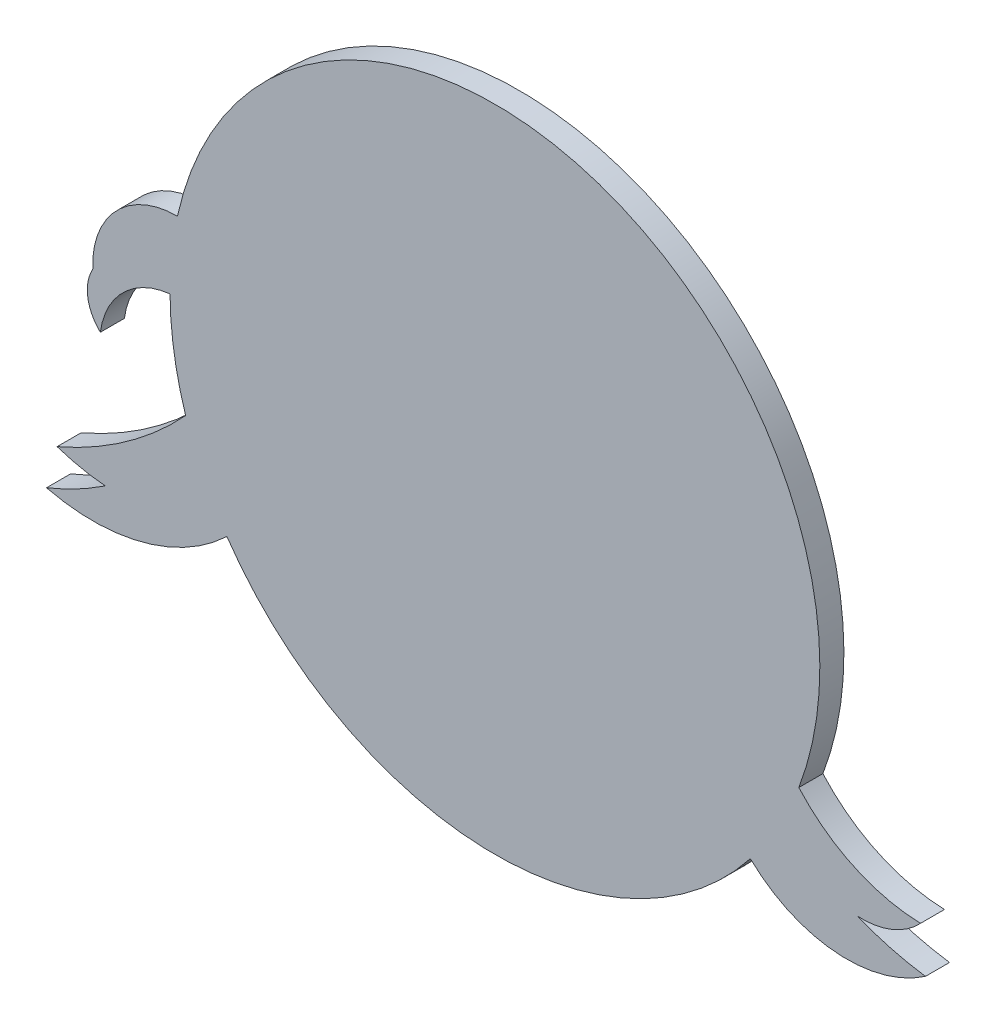
ISO-10303-21;
HEADER;
FILE_DESCRIPTION(('STEP AP214'),'2;1');
FILE_NAME('part.step','',(''),(''),'','','');
FILE_SCHEMA(('AUTOMOTIVE_DESIGN { 1 0 10303 214 1 1 1 1 }'));
ENDSEC;
DATA;
#1=APPLICATION_CONTEXT('core data for automotive mechanical design processes');
#2=APPLICATION_PROTOCOL_DEFINITION('international standard','automotive_design',2000,#1);
#3=PRODUCT_CONTEXT('',#1,'mechanical');
#4=PRODUCT('Part','Part','',(#3));
#5=PRODUCT_RELATED_PRODUCT_CATEGORY('part','',(#4));
#6=PRODUCT_DEFINITION_FORMATION('','',#4);
#7=PRODUCT_DEFINITION_CONTEXT('part definition',#1,'design');
#8=PRODUCT_DEFINITION('design','',#6,#7);
#9=PRODUCT_DEFINITION_SHAPE('','',#8);
#10=(LENGTH_UNIT() NAMED_UNIT(*) SI_UNIT(.MILLI.,.METRE.));
#11=(NAMED_UNIT(*) PLANE_ANGLE_UNIT() SI_UNIT($,.RADIAN.));
#12=(NAMED_UNIT(*) SI_UNIT($,.STERADIAN.) SOLID_ANGLE_UNIT());
#13=UNCERTAINTY_MEASURE_WITH_UNIT(LENGTH_MEASURE(1.E-05),#10,'distance_accuracy_value','');
#14=(GEOMETRIC_REPRESENTATION_CONTEXT(3) GLOBAL_UNCERTAINTY_ASSIGNED_CONTEXT((#13)) GLOBAL_UNIT_ASSIGNED_CONTEXT((#10,
#11,#12)) REPRESENTATION_CONTEXT('',''));
#15=CARTESIAN_POINT('',(0.,0.,0.));
#16=DIRECTION('',(0.,0.,1.));
#17=DIRECTION('',(1.,0.,0.));
#18=AXIS2_PLACEMENT_3D('',#15,#16,#17);
#19=CARTESIAN_POINT('',(53.7015681716826,-0.236669673256251,3.));
#20=DIRECTION('',(0.,0.,-1.));
#21=DIRECTION('',(-1.,0.,0.));
#22=AXIS2_PLACEMENT_3D('',#19,#20,#21);
#23=CYLINDRICAL_SURFACE('',#22,21.1905921058662);
#24=CARTESIAN_POINT('',(53.7015681716826,-0.236669673256251,0.));
#25=DIRECTION('',(0.,0.,-1.));
#26=DIRECTION('',(-1.,0.,0.));
#27=AXIS2_PLACEMENT_3D('',#24,#25,#26);
#28=CIRCLE('',#27,21.1905921058662);
#29=CARTESIAN_POINT('',(53.0386367246914,-21.4168895893428,0.));
#30=VERTEX_POINT('',#29);
#31=CARTESIAN_POINT('',(37.8791462685022,-14.3324902919701,0.));
#32=VERTEX_POINT('',#31);
#33=EDGE_CURVE('E169',#30,#32,#28,.T.);
#34=ORIENTED_EDGE('',*,*,#33,.T.);
#35=DIRECTION('',(0.,0.,-1.));
#36=VECTOR('',#35,1.);
#37=CARTESIAN_POINT('',(37.8791462685022,-14.3324902919701,3.));
#38=LINE('',#37,#36);
#39=CARTESIAN_POINT('',(37.8791462685022,-14.3324902919701,3.));
#40=VERTEX_POINT('',#39);
#41=EDGE_CURVE('E11',#40,#32,#38,.T.);
#42=ORIENTED_EDGE('',*,*,#41,.F.);
#43=CARTESIAN_POINT('',(53.7015681716826,-0.236669673256251,3.));
#44=DIRECTION('',(0.,0.,-1.));
#45=DIRECTION('',(-1.,0.,0.));
#46=AXIS2_PLACEMENT_3D('',#43,#44,#45);
#47=CIRCLE('',#46,21.1905921058662);
#48=CARTESIAN_POINT('',(53.0386367246914,-21.4168895893428,3.));
#49=VERTEX_POINT('',#48);
#50=EDGE_CURVE('E195',#49,#40,#47,.T.);
#51=ORIENTED_EDGE('',*,*,#50,.F.);
#52=DIRECTION('',(0.,0.,-1.));
#53=VECTOR('',#52,1.);
#54=CARTESIAN_POINT('',(53.0386367246914,-21.4168895893428,3.));
#55=LINE('',#54,#53);
#56=EDGE_CURVE('E165',#49,#30,#55,.T.);
#57=ORIENTED_EDGE('',*,*,#56,.T.);
#58=EDGE_LOOP('',(#34,#42,#51,#57));
#59=FACE_BOUND('',#58,.T.);
#60=ADVANCED_FACE('F37',(#59),#23,.F.);
#61=CARTESIAN_POINT('',(0.,0.,3.));
#62=DIRECTION('',(0.,0.,-1.));
#63=DIRECTION('',(-1.,0.,0.));
#64=AXIS2_PLACEMENT_3D('',#61,#62,#63);
#65=CYLINDRICAL_SURFACE('',#64,40.5);
#66=CARTESIAN_POINT('',(0.,0.,0.));
#67=DIRECTION('',(0.,0.,1.));
#68=DIRECTION('',(1.,0.,0.));
#69=AXIS2_PLACEMENT_3D('',#66,#67,#68);
#70=CIRCLE('',#69,40.5);
#71=CARTESIAN_POINT('',(-39.5728639338827,8.61617316854777,0.));
#72=VERTEX_POINT('',#71);
#73=EDGE_CURVE('E172',#32,#72,#70,.T.);
#74=ORIENTED_EDGE('',*,*,#73,.T.);
#75=DIRECTION('',(0.,0.,-1.));
#76=VECTOR('',#75,1.);
#77=CARTESIAN_POINT('',(-39.5728639338827,8.61617316854777,3.));
#78=LINE('',#77,#76);
#79=CARTESIAN_POINT('',(-39.5728639338827,8.61617316854777,3.));
#80=VERTEX_POINT('',#79);
#81=EDGE_CURVE('E45',#80,#72,#78,.T.);
#82=ORIENTED_EDGE('',*,*,#81,.F.);
#83=CARTESIAN_POINT('',(0.,0.,3.));
#84=DIRECTION('',(0.,0.,1.));
#85=DIRECTION('',(1.,0.,0.));
#86=AXIS2_PLACEMENT_3D('',#83,#84,#85);
#87=CIRCLE('',#86,40.5);
#88=EDGE_CURVE('E114',#40,#80,#87,.T.);
#89=ORIENTED_EDGE('',*,*,#88,.F.);
#90=ORIENTED_EDGE('',*,*,#41,.T.);
#91=EDGE_LOOP('',(#74,#82,#89,#90));
#92=FACE_BOUND('',#91,.T.);
#93=ADVANCED_FACE('F283',(#92),#65,.T.);
#94=CARTESIAN_POINT('',(-39.6059922542256,-1.92280846229877,3.));
#95=DIRECTION('',(0.,0.,-1.));
#96=DIRECTION('',(-1.,0.,0.));
#97=AXIS2_PLACEMENT_3D('',#94,#95,#96);
#98=CYLINDRICAL_SURFACE('',#97,10.5390336986334);
#99=CARTESIAN_POINT('',(-39.6059922542256,-1.92280846229877,0.));
#100=DIRECTION('',(0.,0.,1.));
#101=DIRECTION('',(1.,0.,0.));
#102=AXIS2_PLACEMENT_3D('',#99,#100,#101);
#103=CIRCLE('',#102,10.5390336986334);
#104=CARTESIAN_POINT('',(-50.1343074091402,-2.39800452680702,0.));
#105=VERTEX_POINT('',#104);
#106=EDGE_CURVE('E174',#72,#105,#103,.T.);
#107=ORIENTED_EDGE('',*,*,#106,.T.);
#108=DIRECTION('',(0.,0.,-1.));
#109=VECTOR('',#108,1.);
#110=CARTESIAN_POINT('',(-50.1343074091402,-2.39800452680702,3.));
#111=LINE('',#110,#109);
#112=CARTESIAN_POINT('',(-50.1343074091402,-2.39800452680702,3.));
#113=VERTEX_POINT('',#112);
#114=EDGE_CURVE('E220',#113,#105,#111,.T.);
#115=ORIENTED_EDGE('',*,*,#114,.F.);
#116=CARTESIAN_POINT('',(-39.6059922542256,-1.92280846229877,3.));
#117=DIRECTION('',(0.,0.,1.));
#118=DIRECTION('',(1.,0.,0.));
#119=AXIS2_PLACEMENT_3D('',#116,#117,#118);
#120=CIRCLE('',#119,10.5390336986334);
#121=EDGE_CURVE('E228',#80,#113,#120,.T.);
#122=ORIENTED_EDGE('',*,*,#121,.F.);
#123=ORIENTED_EDGE('',*,*,#81,.T.);
#124=EDGE_LOOP('',(#107,#115,#122,#123));
#125=FACE_BOUND('',#124,.T.);
#126=ADVANCED_FACE('F226',(#125),#98,.T.);
#127=CARTESIAN_POINT('',(-45.6304214721293,-4.95539226840726,3.));
#128=DIRECTION('',(0.,0.,-1.));
#129=DIRECTION('',(-1.,0.,0.));
#130=AXIS2_PLACEMENT_3D('',#127,#128,#129);
#131=CYLINDRICAL_SURFACE('',#130,5.17930696082904);
#132=CARTESIAN_POINT('',(-45.6304214721293,-4.95539226840726,0.));
#133=DIRECTION('',(0.,0.,1.));
#134=DIRECTION('',(1.,0.,0.));
#135=AXIS2_PLACEMENT_3D('',#132,#133,#134);
#136=CIRCLE('',#135,5.17930696082904);
#137=CARTESIAN_POINT('',(-49.1863707812971,-8.7210854456485,0.));
#138=VERTEX_POINT('',#137);
#139=EDGE_CURVE('E176',#105,#138,#136,.T.);
#140=ORIENTED_EDGE('',*,*,#139,.T.);
#141=DIRECTION('',(0.,0.,-1.));
#142=VECTOR('',#141,1.);
#143=CARTESIAN_POINT('',(-49.1863707812971,-8.7210854456485,3.));
#144=LINE('',#143,#142);
#145=CARTESIAN_POINT('',(-49.1863707812971,-8.7210854456485,3.));
#146=VERTEX_POINT('',#145);
#147=EDGE_CURVE('E217',#146,#138,#144,.T.);
#148=ORIENTED_EDGE('',*,*,#147,.F.);
#149=CARTESIAN_POINT('',(-45.6304214721293,-4.95539226840726,3.));
#150=DIRECTION('',(0.,0.,1.));
#151=DIRECTION('',(1.,0.,0.));
#152=AXIS2_PLACEMENT_3D('',#149,#150,#151);
#153=CIRCLE('',#152,5.17930696082904);
#154=EDGE_CURVE('E246',#113,#146,#153,.T.);
#155=ORIENTED_EDGE('',*,*,#154,.F.);
#156=ORIENTED_EDGE('',*,*,#114,.T.);
#157=EDGE_LOOP('',(#140,#148,#155,#156));
#158=FACE_BOUND('',#157,.T.);
#159=ADVANCED_FACE('F237',(#158),#131,.T.);
#160=CARTESIAN_POINT('',(-39.4446554951835,-10.0059949421069,3.));
#161=DIRECTION('',(0.,0.,-1.));
#162=DIRECTION('',(-1.,0.,0.));
#163=AXIS2_PLACEMENT_3D('',#160,#161,#162);
#164=CYLINDRICAL_SURFACE('',#163,9.82608819061717);
#165=CARTESIAN_POINT('',(-39.4446554951835,-10.0059949421069,0.));
#166=DIRECTION('',(0.,0.,-1.));
#167=DIRECTION('',(1.,0.,0.));
#168=AXIS2_PLACEMENT_3D('',#165,#166,#167);
#169=CIRCLE('',#168,9.82608819061717);
#170=CARTESIAN_POINT('',(-40.4993084813279,-0.236669673256249,0.));
#171=VERTEX_POINT('',#170);
#172=EDGE_CURVE('E178',#138,#171,#169,.T.);
#173=ORIENTED_EDGE('',*,*,#172,.T.);
#174=DIRECTION('',(0.,0.,-1.));
#175=VECTOR('',#174,1.);
#176=CARTESIAN_POINT('',(-40.4993084813279,-0.236669673256249,3.));
#177=LINE('',#176,#175);
#178=CARTESIAN_POINT('',(-40.4993084813279,-0.236669673256249,3.));
#179=VERTEX_POINT('',#178);
#180=EDGE_CURVE('E214',#179,#171,#177,.T.);
#181=ORIENTED_EDGE('',*,*,#180,.F.);
#182=CARTESIAN_POINT('',(-39.4446554951835,-10.0059949421069,3.));
#183=DIRECTION('',(0.,0.,-1.));
#184=DIRECTION('',(1.,0.,0.));
#185=AXIS2_PLACEMENT_3D('',#182,#183,#184);
#186=CIRCLE('',#185,9.82608819061717);
#187=EDGE_CURVE('E243',#146,#179,#186,.T.);
#188=ORIENTED_EDGE('',*,*,#187,.F.);
#189=ORIENTED_EDGE('',*,*,#147,.T.);
#190=EDGE_LOOP('',(#173,#181,#188,#189));
#191=FACE_BOUND('',#190,.T.);
#192=ADVANCED_FACE('F241',(#191),#164,.F.);
#193=CARTESIAN_POINT('',(0.,0.,3.));
#194=DIRECTION('',(0.,0.,-1.));
#195=DIRECTION('',(-1.,0.,0.));
#196=AXIS2_PLACEMENT_3D('',#193,#194,#195);
#197=CYLINDRICAL_SURFACE('',#196,40.5);
#198=CARTESIAN_POINT('',(0.,0.,0.));
#199=DIRECTION('',(0.,0.,1.));
#200=DIRECTION('',(1.,0.,0.));
#201=AXIS2_PLACEMENT_3D('',#198,#199,#200);
#202=CIRCLE('',#201,40.5);
#203=CARTESIAN_POINT('',(-38.5561689149831,-12.3964445950962,0.));
#204=VERTEX_POINT('',#203);
#205=EDGE_CURVE('E180',#171,#204,#202,.T.);
#206=ORIENTED_EDGE('',*,*,#205,.T.);
#207=DIRECTION('',(0.,0.,-1.));
#208=VECTOR('',#207,1.);
#209=CARTESIAN_POINT('',(-38.5561689149831,-12.3964445950962,3.));
#210=LINE('',#209,#208);
#211=CARTESIAN_POINT('',(-38.5561689149831,-12.3964445950962,3.));
#212=VERTEX_POINT('',#211);
#213=EDGE_CURVE('E211',#212,#204,#210,.T.);
#214=ORIENTED_EDGE('',*,*,#213,.F.);
#215=CARTESIAN_POINT('',(0.,0.,3.));
#216=DIRECTION('',(0.,0.,1.));
#217=DIRECTION('',(1.,0.,0.));
#218=AXIS2_PLACEMENT_3D('',#215,#216,#217);
#219=CIRCLE('',#218,40.5);
#220=EDGE_CURVE('E245',#179,#212,#219,.T.);
#221=ORIENTED_EDGE('',*,*,#220,.F.);
#222=ORIENTED_EDGE('',*,*,#180,.T.);
#223=EDGE_LOOP('',(#206,#214,#221,#222));
#224=FACE_BOUND('',#223,.T.);
#225=ADVANCED_FACE('F296',(#224),#197,.T.);
#226=CARTESIAN_POINT('',(-73.2190479079204,19.485632249498,3.));
#227=DIRECTION('',(0.,0.,-1.));
#228=DIRECTION('',(-1.,0.,0.));
#229=AXIS2_PLACEMENT_3D('',#226,#227,#228);
#230=CYLINDRICAL_SURFACE('',#229,47.0954562989215);
#231=CARTESIAN_POINT('',(-73.2190479079204,19.485632249498,0.));
#232=DIRECTION('',(0.,0.,-1.));
#233=DIRECTION('',(1.,0.,0.));
#234=AXIS2_PLACEMENT_3D('',#231,#232,#233);
#235=CIRCLE('',#234,47.0954562989215);
#236=CARTESIAN_POINT('',(-54.5791607753902,-23.7640684626475,0.));
#237=VERTEX_POINT('',#236);
#238=EDGE_CURVE('E182',#204,#237,#235,.T.);
#239=ORIENTED_EDGE('',*,*,#238,.T.);
#240=DIRECTION('',(0.,0.,-1.));
#241=VECTOR('',#240,1.);
#242=CARTESIAN_POINT('',(-54.5791607753902,-23.7640684626475,3.));
#243=LINE('',#242,#241);
#244=CARTESIAN_POINT('',(-54.5791607753902,-23.7640684626475,3.));
#245=VERTEX_POINT('',#244);
#246=EDGE_CURVE('E208',#245,#237,#243,.T.);
#247=ORIENTED_EDGE('',*,*,#246,.F.);
#248=CARTESIAN_POINT('',(-73.2190479079204,19.485632249498,3.));
#249=DIRECTION('',(0.,0.,-1.));
#250=DIRECTION('',(1.,0.,0.));
#251=AXIS2_PLACEMENT_3D('',#248,#249,#250);
#252=CIRCLE('',#251,47.0954562989215);
#253=EDGE_CURVE('E248',#212,#245,#252,.T.);
#254=ORIENTED_EDGE('',*,*,#253,.F.);
#255=ORIENTED_EDGE('',*,*,#213,.T.);
#256=EDGE_LOOP('',(#239,#247,#254,#255));
#257=FACE_BOUND('',#256,.T.);
#258=ADVANCED_FACE('F299',(#257),#230,.F.);
#259=CARTESIAN_POINT('',(-46.4974879228673,0.298127224619478,3.));
#260=DIRECTION('',(0.,0.,-1.));
#261=DIRECTION('',(-1.,0.,0.));
#262=AXIS2_PLACEMENT_3D('',#259,#260,#261);
#263=CYLINDRICAL_SURFACE('',#262,25.383118354283);
#264=CARTESIAN_POINT('',(-46.4974879228673,0.298127224619478,0.));
#265=DIRECTION('',(0.,0.,1.));
#266=DIRECTION('',(-1.,0.,0.));
#267=AXIS2_PLACEMENT_3D('',#264,#265,#266);
#268=CIRCLE('',#267,25.383118354283);
#269=CARTESIAN_POINT('',(-48.5729291565579,-25.,0.));
#270=VERTEX_POINT('',#269);
#271=EDGE_CURVE('E184',#237,#270,#268,.T.);
#272=ORIENTED_EDGE('',*,*,#271,.T.);
#273=DIRECTION('',(0.,0.,-1.));
#274=VECTOR('',#273,1.);
#275=CARTESIAN_POINT('',(-48.5729291565579,-25.,3.));
#276=LINE('',#275,#274);
#277=CARTESIAN_POINT('',(-48.5729291565579,-25.,3.));
#278=VERTEX_POINT('',#277);
#279=EDGE_CURVE('E205',#278,#270,#276,.T.);
#280=ORIENTED_EDGE('',*,*,#279,.F.);
#281=CARTESIAN_POINT('',(-46.4974879228673,0.298127224619478,3.));
#282=DIRECTION('',(0.,0.,1.));
#283=DIRECTION('',(-1.,0.,0.));
#284=AXIS2_PLACEMENT_3D('',#281,#282,#283);
#285=CIRCLE('',#284,25.383118354283);
#286=EDGE_CURVE('E254',#245,#278,#285,.T.);
#287=ORIENTED_EDGE('',*,*,#286,.F.);
#288=ORIENTED_EDGE('',*,*,#246,.T.);
#289=EDGE_LOOP('',(#272,#280,#287,#288));
#290=FACE_BOUND('',#289,.T.);
#291=ADVANCED_FACE('F303',(#290),#263,.T.);
#292=CARTESIAN_POINT('',(-70.4185005206799,7.54622092385279,3.));
#293=DIRECTION('',(0.,0.,-1.));
#294=DIRECTION('',(-1.,0.,0.));
#295=AXIS2_PLACEMENT_3D('',#292,#293,#294);
#296=CYLINDRICAL_SURFACE('',#295,39.1980290913865);
#297=CARTESIAN_POINT('',(-70.4185005206799,7.54622092385279,0.));
#298=DIRECTION('',(0.,0.,-1.));
#299=DIRECTION('',(1.,0.,0.));
#300=AXIS2_PLACEMENT_3D('',#297,#298,#299);
#301=CIRCLE('',#300,39.1980290913865);
#302=CARTESIAN_POINT('',(-55.8999026146519,-28.8638848092024,0.));
#303=VERTEX_POINT('',#302);
#304=EDGE_CURVE('E186',#270,#303,#301,.T.);
#305=ORIENTED_EDGE('',*,*,#304,.T.);
#306=DIRECTION('',(0.,0.,-1.));
#307=VECTOR('',#306,1.);
#308=CARTESIAN_POINT('',(-55.8999026146519,-28.8638848092024,3.));
#309=LINE('',#308,#307);
#310=CARTESIAN_POINT('',(-55.8999026146519,-28.8638848092024,3.));
#311=VERTEX_POINT('',#310);
#312=EDGE_CURVE('E202',#311,#303,#309,.T.);
#313=ORIENTED_EDGE('',*,*,#312,.F.);
#314=CARTESIAN_POINT('',(-70.4185005206799,7.54622092385279,3.));
#315=DIRECTION('',(0.,0.,-1.));
#316=DIRECTION('',(1.,0.,0.));
#317=AXIS2_PLACEMENT_3D('',#314,#315,#316);
#318=CIRCLE('',#317,39.1980290913865);
#319=EDGE_CURVE('E256',#278,#311,#318,.T.);
#320=ORIENTED_EDGE('',*,*,#319,.F.);
#321=ORIENTED_EDGE('',*,*,#279,.T.);
#322=EDGE_LOOP('',(#305,#313,#320,#321));
#323=FACE_BOUND('',#322,.T.);
#324=ADVANCED_FACE('F307',(#323),#296,.F.);
#325=CARTESIAN_POINT('',(-50.1343074091402,-5.28261508736933,3.));
#326=DIRECTION('',(0.,0.,-1.));
#327=DIRECTION('',(-1.,0.,0.));
#328=AXIS2_PLACEMENT_3D('',#325,#326,#327);
#329=CYLINDRICAL_SURFACE('',#328,24.2758804117927);
#330=CARTESIAN_POINT('',(-50.1343074091402,-5.28261508736933,0.));
#331=DIRECTION('',(0.,0.,1.));
#332=DIRECTION('',(1.,0.,0.));
#333=AXIS2_PLACEMENT_3D('',#330,#331,#332);
#334=CIRCLE('',#333,24.2758804117927);
#335=CARTESIAN_POINT('',(-33.4153955418445,-22.8836478906244,0.));
#336=VERTEX_POINT('',#335);
#337=EDGE_CURVE('E188',#303,#336,#334,.T.);
#338=ORIENTED_EDGE('',*,*,#337,.T.);
#339=DIRECTION('',(0.,0.,-1.));
#340=VECTOR('',#339,1.);
#341=CARTESIAN_POINT('',(-33.4153955418445,-22.8836478906244,3.));
#342=LINE('',#341,#340);
#343=CARTESIAN_POINT('',(-33.4153955418445,-22.8836478906244,3.));
#344=VERTEX_POINT('',#343);
#345=EDGE_CURVE('E199',#344,#336,#342,.T.);
#346=ORIENTED_EDGE('',*,*,#345,.F.);
#347=CARTESIAN_POINT('',(-50.1343074091402,-5.28261508736933,3.));
#348=DIRECTION('',(0.,0.,1.));
#349=DIRECTION('',(1.,0.,0.));
#350=AXIS2_PLACEMENT_3D('',#347,#348,#349);
#351=CIRCLE('',#350,24.2758804117927);
#352=EDGE_CURVE('E258',#311,#344,#351,.T.);
#353=ORIENTED_EDGE('',*,*,#352,.F.);
#354=ORIENTED_EDGE('',*,*,#312,.T.);
#355=EDGE_LOOP('',(#338,#346,#353,#354));
#356=FACE_BOUND('',#355,.T.);
#357=ADVANCED_FACE('F264',(#356),#329,.T.);
#358=CARTESIAN_POINT('',(0.,0.,3.));
#359=DIRECTION('',(0.,0.,-1.));
#360=DIRECTION('',(-1.,0.,0.));
#361=AXIS2_PLACEMENT_3D('',#358,#359,#360);
#362=CYLINDRICAL_SURFACE('',#361,40.5);
#363=CARTESIAN_POINT('',(0.,0.,0.));
#364=DIRECTION('',(0.,0.,1.));
#365=DIRECTION('',(1.,0.,0.));
#366=AXIS2_PLACEMENT_3D('',#363,#364,#365);
#367=CIRCLE('',#366,40.5);
#368=CARTESIAN_POINT('',(31.8377446668377,-25.0321396314667,0.));
#369=VERTEX_POINT('',#368);
#370=EDGE_CURVE('E190',#336,#369,#367,.T.);
#371=ORIENTED_EDGE('',*,*,#370,.T.);
#372=DIRECTION('',(0.,0.,-1.));
#373=VECTOR('',#372,1.);
#374=CARTESIAN_POINT('',(31.8377446668377,-25.0321396314667,3.));
#375=LINE('',#374,#373);
#376=CARTESIAN_POINT('',(31.8377446668377,-25.0321396314667,3.));
#377=VERTEX_POINT('',#376);
#378=EDGE_CURVE('E160',#377,#369,#375,.T.);
#379=ORIENTED_EDGE('',*,*,#378,.F.);
#380=CARTESIAN_POINT('',(0.,0.,3.));
#381=DIRECTION('',(0.,0.,1.));
#382=DIRECTION('',(1.,0.,0.));
#383=AXIS2_PLACEMENT_3D('',#380,#381,#382);
#384=CIRCLE('',#383,40.5);
#385=EDGE_CURVE('E151',#344,#377,#384,.T.);
#386=ORIENTED_EDGE('',*,*,#385,.F.);
#387=ORIENTED_EDGE('',*,*,#345,.T.);
#388=EDGE_LOOP('',(#371,#379,#386,#387));
#389=FACE_BOUND('',#388,.T.);
#390=ADVANCED_FACE('F268',(#389),#362,.T.);
#391=CARTESIAN_POINT('',(43.8510849780195,-12.5478668411019,3.));
#392=DIRECTION('',(0.,0.,-1.));
#393=DIRECTION('',(-1.,0.,0.));
#394=AXIS2_PLACEMENT_3D('',#391,#392,#393);
#395=CYLINDRICAL_SURFACE('',#394,17.3256287775222);
#396=CARTESIAN_POINT('',(43.8510849780195,-12.5478668411019,0.));
#397=DIRECTION('',(0.,0.,1.));
#398=DIRECTION('',(1.,0.,0.));
#399=AXIS2_PLACEMENT_3D('',#396,#397,#398);
#400=CIRCLE('',#399,17.3256287775222);
#401=CARTESIAN_POINT('',(53.6609982195845,-26.8287286753706,0.));
#402=VERTEX_POINT('',#401);
#403=EDGE_CURVE('E159',#369,#402,#400,.T.);
#404=ORIENTED_EDGE('',*,*,#403,.T.);
#405=DIRECTION('',(0.,0.,-1.));
#406=VECTOR('',#405,1.);
#407=CARTESIAN_POINT('',(53.6609982195845,-26.8287286753706,3.));
#408=LINE('',#407,#406);
#409=CARTESIAN_POINT('',(53.6609982195845,-26.8287286753706,3.));
#410=VERTEX_POINT('',#409);
#411=EDGE_CURVE('E156',#410,#402,#408,.T.);
#412=ORIENTED_EDGE('',*,*,#411,.F.);
#413=CARTESIAN_POINT('',(43.8510849780195,-12.5478668411019,3.));
#414=DIRECTION('',(0.,0.,1.));
#415=DIRECTION('',(1.,0.,0.));
#416=AXIS2_PLACEMENT_3D('',#413,#414,#415);
#417=CIRCLE('',#416,17.3256287775222);
#418=EDGE_CURVE('E145',#377,#410,#417,.T.);
#419=ORIENTED_EDGE('',*,*,#418,.F.);
#420=ORIENTED_EDGE('',*,*,#378,.T.);
#421=EDGE_LOOP('',(#404,#412,#419,#420));
#422=FACE_BOUND('',#421,.T.);
#423=ADVANCED_FACE('F157',(#422),#395,.T.);
#424=CARTESIAN_POINT('',(58.8656030489316,9.80686294367108,3.));
#425=DIRECTION('',(0.,0.,-1.));
#426=DIRECTION('',(-1.,0.,0.));
#427=AXIS2_PLACEMENT_3D('',#424,#425,#426);
#428=CYLINDRICAL_SURFACE('',#427,37.003438822721);
#429=CARTESIAN_POINT('',(58.8656030489316,9.80686294367108,0.));
#430=DIRECTION('',(0.,0.,-1.));
#431=DIRECTION('',(-1.,0.,0.));
#432=AXIS2_PLACEMENT_3D('',#429,#430,#431);
#433=CIRCLE('',#432,37.003438822721);
#434=CARTESIAN_POINT('',(45.1373516590908,-24.5557562592388,0.));
#435=VERTEX_POINT('',#434);
#436=EDGE_CURVE('E100',#402,#435,#433,.T.);
#437=ORIENTED_EDGE('',*,*,#436,.T.);
#438=DIRECTION('',(0.,0.,-1.));
#439=VECTOR('',#438,1.);
#440=CARTESIAN_POINT('',(45.1373516590908,-24.5557562592388,3.));
#441=LINE('',#440,#439);
#442=CARTESIAN_POINT('',(45.1373516590908,-24.5557562592388,3.));
#443=VERTEX_POINT('',#442);
#444=EDGE_CURVE('E161',#443,#435,#441,.T.);
#445=ORIENTED_EDGE('',*,*,#444,.F.);
#446=CARTESIAN_POINT('',(58.8656030489316,9.80686294367108,3.));
#447=DIRECTION('',(0.,0.,-1.));
#448=DIRECTION('',(-1.,0.,0.));
#449=AXIS2_PLACEMENT_3D('',#446,#447,#448);
#450=CIRCLE('',#449,37.003438822721);
#451=EDGE_CURVE('E149',#410,#443,#450,.T.);
#452=ORIENTED_EDGE('',*,*,#451,.F.);
#453=ORIENTED_EDGE('',*,*,#411,.T.);
#454=EDGE_LOOP('',(#437,#445,#452,#453));
#455=FACE_BOUND('',#454,.T.);
#456=ADVANCED_FACE('F163',(#455),#428,.F.);
#457=CARTESIAN_POINT('',(45.7421098025192,-14.5639242889752,3.));
#458=DIRECTION('',(0.,0.,-1.));
#459=DIRECTION('',(-1.,0.,0.));
#460=AXIS2_PLACEMENT_3D('',#457,#458,#459);
#461=CYLINDRICAL_SURFACE('',#460,10.0101168092099);
#462=CARTESIAN_POINT('',(45.7421098025192,-14.5639242889752,0.));
#463=DIRECTION('',(0.,0.,1.));
#464=DIRECTION('',(1.,0.,0.));
#465=AXIS2_PLACEMENT_3D('',#462,#463,#464);
#466=CIRCLE('',#465,10.0101168092099);
#467=EDGE_CURVE('E106',#435,#30,#466,.T.);
#468=ORIENTED_EDGE('',*,*,#467,.T.);
#469=ORIENTED_EDGE('',*,*,#56,.F.);
#470=CARTESIAN_POINT('',(45.7421098025192,-14.5639242889752,3.));
#471=DIRECTION('',(0.,0.,1.));
#472=DIRECTION('',(1.,0.,0.));
#473=AXIS2_PLACEMENT_3D('',#470,#471,#472);
#474=CIRCLE('',#473,10.0101168092099);
#475=EDGE_CURVE('E53',#443,#49,#474,.T.);
#476=ORIENTED_EDGE('',*,*,#475,.F.);
#477=ORIENTED_EDGE('',*,*,#444,.T.);
#478=EDGE_LOOP('',(#468,#469,#476,#477));
#479=FACE_BOUND('',#478,.T.);
#480=ADVANCED_FACE('F272',(#479),#461,.T.);
#481=CARTESIAN_POINT('',(26.8507840858413,-0.118334836628126,3.));
#482=DIRECTION('',(0.,0.,-1.));
#483=DIRECTION('',(-1.,0.,0.));
#484=AXIS2_PLACEMENT_3D('',#481,#482,#483);
#485=PLANE('',#484);
#486=ORIENTED_EDGE('',*,*,#50,.T.);
#487=ORIENTED_EDGE('',*,*,#88,.T.);
#488=ORIENTED_EDGE('',*,*,#121,.T.);
#489=ORIENTED_EDGE('',*,*,#154,.T.);
#490=ORIENTED_EDGE('',*,*,#187,.T.);
#491=ORIENTED_EDGE('',*,*,#220,.T.);
#492=ORIENTED_EDGE('',*,*,#253,.T.);
#493=ORIENTED_EDGE('',*,*,#286,.T.);
#494=ORIENTED_EDGE('',*,*,#319,.T.);
#495=ORIENTED_EDGE('',*,*,#352,.T.);
#496=ORIENTED_EDGE('',*,*,#385,.T.);
#497=ORIENTED_EDGE('',*,*,#418,.T.);
#498=ORIENTED_EDGE('',*,*,#451,.T.);
#499=ORIENTED_EDGE('',*,*,#475,.T.);
#500=EDGE_LOOP('',(#486,#487,#488,#489,#490,#491,#492,#493,#494,#495,#496,#497,#498,#499));
#501=FACE_BOUND('',#500,.T.);
#502=ADVANCED_FACE('F147',(#501),#485,.F.);
#503=CARTESIAN_POINT('',(26.8507840858413,-0.118334836628126,0.));
#504=DIRECTION('',(0.,0.,-1.));
#505=DIRECTION('',(-1.,0.,0.));
#506=AXIS2_PLACEMENT_3D('',#503,#504,#505);
#507=PLANE('',#506);
#508=ORIENTED_EDGE('',*,*,#33,.F.);
#509=ORIENTED_EDGE('',*,*,#467,.F.);
#510=ORIENTED_EDGE('',*,*,#436,.F.);
#511=ORIENTED_EDGE('',*,*,#403,.F.);
#512=ORIENTED_EDGE('',*,*,#370,.F.);
#513=ORIENTED_EDGE('',*,*,#337,.F.);
#514=ORIENTED_EDGE('',*,*,#304,.F.);
#515=ORIENTED_EDGE('',*,*,#271,.F.);
#516=ORIENTED_EDGE('',*,*,#238,.F.);
#517=ORIENTED_EDGE('',*,*,#205,.F.);
#518=ORIENTED_EDGE('',*,*,#172,.F.);
#519=ORIENTED_EDGE('',*,*,#139,.F.);
#520=ORIENTED_EDGE('',*,*,#106,.F.);
#521=ORIENTED_EDGE('',*,*,#73,.F.);
#522=EDGE_LOOP('',(#508,#509,#510,#511,#512,#513,#514,#515,#516,#517,#518,#519,#520,#521));
#523=FACE_BOUND('',#522,.T.);
#524=ADVANCED_FACE('F232',(#523),#507,.T.);
#525=CLOSED_SHELL('',(#60,#93,#126,#159,#192,#225,#258,#291,#324,#357,#390,#423,#456,#480,#502,#524));
#526=MANIFOLD_SOLID_BREP('B2',#525);
#527=ADVANCED_BREP_SHAPE_REPRESENTATION('',(#18,#526),#14);
#528=SHAPE_DEFINITION_REPRESENTATION(#9,#527);
ENDSEC;
END-ISO-10303-21;
